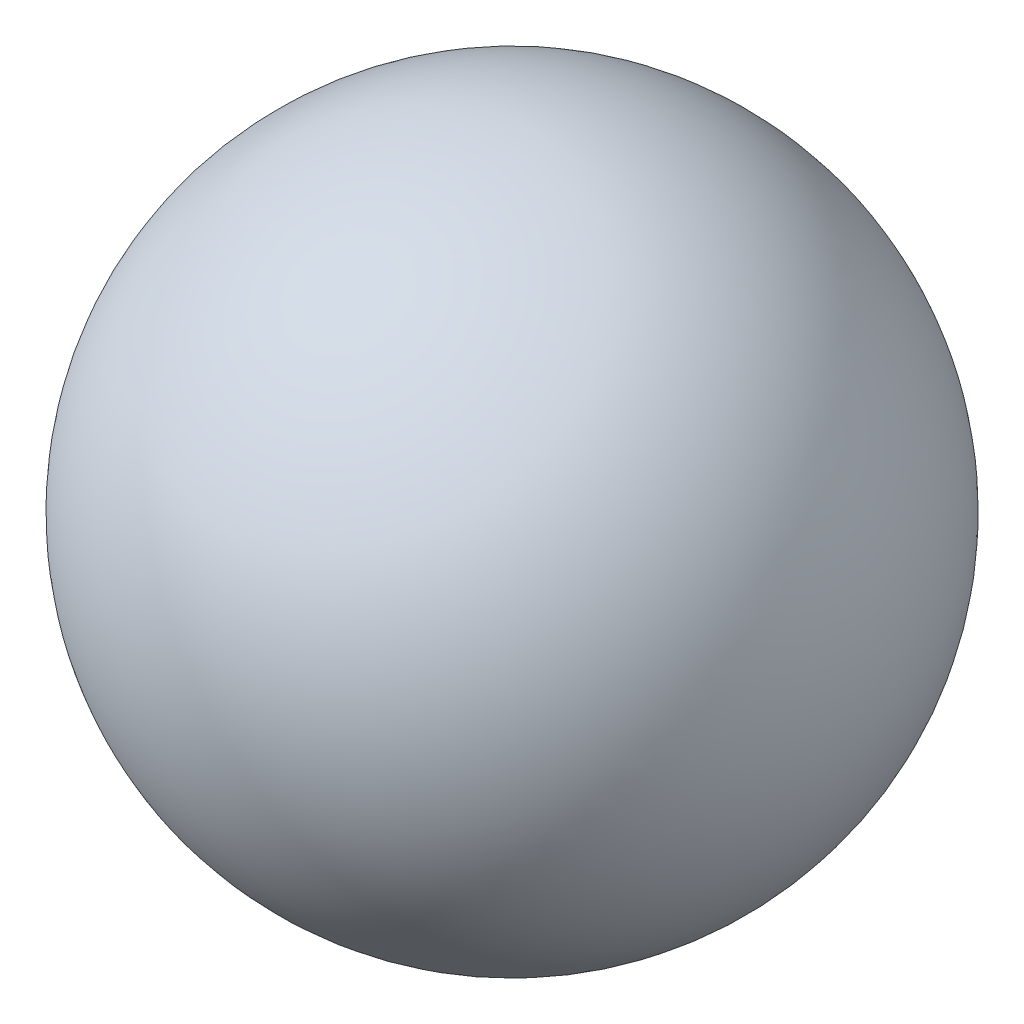
ISO-10303-21;
HEADER;
FILE_DESCRIPTION(('STEP AP214'),'2;1');
FILE_NAME('part.step','',(''),(''),'','','');
FILE_SCHEMA(('AUTOMOTIVE_DESIGN { 1 0 10303 214 1 1 1 1 }'));
ENDSEC;
DATA;
#1=APPLICATION_CONTEXT('core data for automotive mechanical design processes');
#2=APPLICATION_PROTOCOL_DEFINITION('international standard','automotive_design',2000,#1);
#3=PRODUCT_CONTEXT('',#1,'mechanical');
#4=PRODUCT('Part','Part','',(#3));
#5=PRODUCT_RELATED_PRODUCT_CATEGORY('part','',(#4));
#6=PRODUCT_DEFINITION_FORMATION('','',#4);
#7=PRODUCT_DEFINITION_CONTEXT('part definition',#1,'design');
#8=PRODUCT_DEFINITION('design','',#6,#7);
#9=PRODUCT_DEFINITION_SHAPE('','',#8);
#10=(LENGTH_UNIT() NAMED_UNIT(*) SI_UNIT(.MILLI.,.METRE.));
#11=(NAMED_UNIT(*) PLANE_ANGLE_UNIT() SI_UNIT($,.RADIAN.));
#12=(NAMED_UNIT(*) SI_UNIT($,.STERADIAN.) SOLID_ANGLE_UNIT());
#13=UNCERTAINTY_MEASURE_WITH_UNIT(LENGTH_MEASURE(1.E-05),#10,'distance_accuracy_value','');
#14=(GEOMETRIC_REPRESENTATION_CONTEXT(3) GLOBAL_UNCERTAINTY_ASSIGNED_CONTEXT((#13)) GLOBAL_UNIT_ASSIGNED_CONTEXT((#10,
#11,#12)) REPRESENTATION_CONTEXT('',''));
#15=CARTESIAN_POINT('',(0.,0.,0.));
#16=DIRECTION('',(0.,0.,1.));
#17=DIRECTION('',(1.,0.,0.));
#18=AXIS2_PLACEMENT_3D('',#15,#16,#17);
#19=CARTESIAN_POINT('',(0.,0.,5.5));
#20=DIRECTION('',(0.,0.,1.));
#21=DIRECTION('',(-1.,0.,0.));
#22=AXIS2_PLACEMENT_3D('',#19,#20,#21);
#23=SPHERICAL_SURFACE('',#22,4.7625);
#24=CARTESIAN_POINT('',(0.,0.,10.2625));
#25=VERTEX_POINT('',#24);
#26=VERTEX_LOOP('',#25);
#27=FACE_BOUND('',#26,.T.);
#28=ADVANCED_FACE('F26',(#27),#23,.T.);
#29=CLOSED_SHELL('',(#28));
#30=MANIFOLD_SOLID_BREP('B2',#29);
#31=ADVANCED_BREP_SHAPE_REPRESENTATION('',(#18,#30),#14);
#32=SHAPE_DEFINITION_REPRESENTATION(#9,#31);
ENDSEC;
END-ISO-10303-21;
